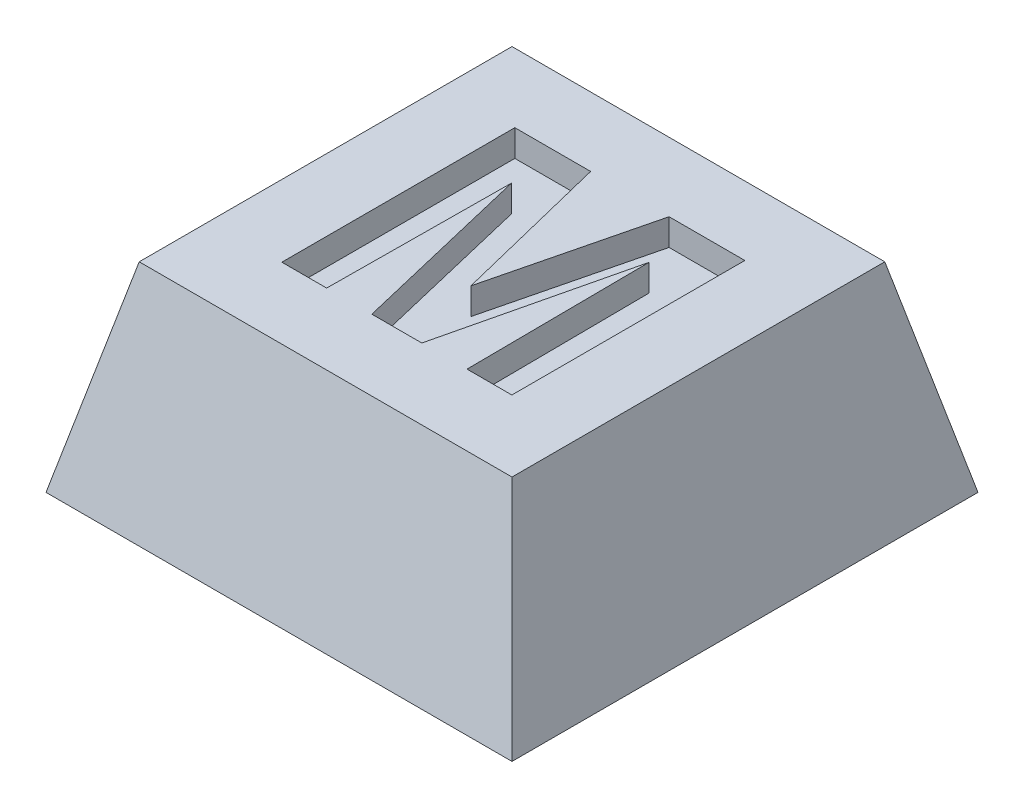
ISO-10303-21;
HEADER;
FILE_DESCRIPTION(('STEP AP214'),'2;1');
FILE_NAME('part.step','',(''),(''),'','','');
FILE_SCHEMA(('AUTOMOTIVE_DESIGN { 1 0 10303 214 1 1 1 1 }'));
ENDSEC;
DATA;
#1=APPLICATION_CONTEXT('core data for automotive mechanical design processes');
#2=APPLICATION_PROTOCOL_DEFINITION('international standard','automotive_design',2000,#1);
#3=PRODUCT_CONTEXT('',#1,'mechanical');
#4=PRODUCT('Part','Part','',(#3));
#5=PRODUCT_RELATED_PRODUCT_CATEGORY('part','',(#4));
#6=PRODUCT_DEFINITION_FORMATION('','',#4);
#7=PRODUCT_DEFINITION_CONTEXT('part definition',#1,'design');
#8=PRODUCT_DEFINITION('design','',#6,#7);
#9=PRODUCT_DEFINITION_SHAPE('','',#8);
#10=(LENGTH_UNIT() NAMED_UNIT(*) SI_UNIT(.MILLI.,.METRE.));
#11=(NAMED_UNIT(*) PLANE_ANGLE_UNIT() SI_UNIT($,.RADIAN.));
#12=(NAMED_UNIT(*) SI_UNIT($,.STERADIAN.) SOLID_ANGLE_UNIT());
#13=UNCERTAINTY_MEASURE_WITH_UNIT(LENGTH_MEASURE(1.E-05),#10,'distance_accuracy_value','');
#14=(GEOMETRIC_REPRESENTATION_CONTEXT(3) GLOBAL_UNCERTAINTY_ASSIGNED_CONTEXT((#13)) GLOBAL_UNIT_ASSIGNED_CONTEXT((#10,
#11,#12)) REPRESENTATION_CONTEXT('',''));
#15=CARTESIAN_POINT('',(0.,0.,0.));
#16=DIRECTION('',(0.,0.,1.));
#17=DIRECTION('',(1.,0.,0.));
#18=AXIS2_PLACEMENT_3D('',#15,#16,#17);
#19=CARTESIAN_POINT('',(0.,3.,0.));
#20=DIRECTION('',(0.,-1.,0.));
#21=DIRECTION('',(0.,0.,-1.));
#22=AXIS2_PLACEMENT_3D('',#19,#20,#21);
#23=PLANE('',#22);
#24=DIRECTION('',(-1.,0.,0.));
#25=VECTOR('',#24,1.);
#26=CARTESIAN_POINT('',(11.,3.,-0.7));
#27=LINE('',#26,#25);
#28=CARTESIAN_POINT('',(6.3,3.,-0.7));
#29=VERTEX_POINT('',#28);
#30=CARTESIAN_POINT('',(0.7,3.,-0.7));
#31=VERTEX_POINT('',#30);
#32=EDGE_CURVE('E65',#29,#31,#27,.T.);
#33=ORIENTED_EDGE('',*,*,#32,.F.);
#34=DIRECTION('',(0.,0.,1.));
#35=VECTOR('',#34,1.);
#36=CARTESIAN_POINT('',(6.3,3.,-7.));
#37=LINE('',#36,#35);
#38=CARTESIAN_POINT('',(6.3,3.,-6.3));
#39=VERTEX_POINT('',#38);
#40=EDGE_CURVE('E212',#39,#29,#37,.T.);
#41=ORIENTED_EDGE('',*,*,#40,.F.);
#42=DIRECTION('',(-1.,0.,0.));
#43=VECTOR('',#42,1.);
#44=CARTESIAN_POINT('',(11.,3.,-6.3));
#45=LINE('',#44,#43);
#46=CARTESIAN_POINT('',(0.699999999999998,3.,-6.3));
#47=VERTEX_POINT('',#46);
#48=EDGE_CURVE('E199',#39,#47,#45,.T.);
#49=ORIENTED_EDGE('',*,*,#48,.T.);
#50=DIRECTION('',(0.,0.,1.));
#51=VECTOR('',#50,1.);
#52=CARTESIAN_POINT('',(0.7,3.,-7.));
#53=LINE('',#52,#51);
#54=EDGE_CURVE('E213',#47,#31,#53,.T.);
#55=ORIENTED_EDGE('',*,*,#54,.T.);
#56=EDGE_LOOP('',(#33,#41,#49,#55));
#57=FACE_BOUND('',#56,.T.);
#58=DIRECTION('',(-1.,0.,0.));
#59=VECTOR('',#58,1.);
#60=CARTESIAN_POINT('',(2.44959526303558,3.,-1.76602931918881));
#61=LINE('',#60,#59);
#62=CARTESIAN_POINT('',(2.44959526303558,3.,-1.76602931918881));
#63=VERTEX_POINT('',#62);
#64=CARTESIAN_POINT('',(1.77651833995866,3.,-1.76602931918881));
#65=VERTEX_POINT('',#64);
#66=EDGE_CURVE('E58',#63,#65,#61,.T.);
#67=ORIENTED_EDGE('',*,*,#66,.T.);
#68=DIRECTION('',(0.,0.,-1.));
#69=VECTOR('',#68,1.);
#70=CARTESIAN_POINT('',(1.77651833995866,3.,-1.76602931918881));
#71=LINE('',#70,#69);
#72=CARTESIAN_POINT('',(1.77651833995866,3.,-5.26602931918881));
#73=VERTEX_POINT('',#72);
#74=EDGE_CURVE('E183',#65,#73,#71,.T.);
#75=ORIENTED_EDGE('',*,*,#74,.T.);
#76=DIRECTION('',(1.,0.,0.));
#77=VECTOR('',#76,1.);
#78=CARTESIAN_POINT('',(1.77651833995866,3.,-5.26602931918881));
#79=LINE('',#78,#77);
#80=CARTESIAN_POINT('',(2.91514013483045,3.,-5.26602931918881));
#81=VERTEX_POINT('',#80);
#82=EDGE_CURVE('E553',#73,#81,#79,.T.);
#83=ORIENTED_EDGE('',*,*,#82,.T.);
#84=DIRECTION('',(0.239515349551575,0.,0.970892577646563));
#85=VECTOR('',#84,1.);
#86=CARTESIAN_POINT('',(2.91514013483045,3.,-5.26602931918881));
#87=LINE('',#86,#85);
#88=CARTESIAN_POINT('',(3.50408244252276,3.,-2.87870960765035));
#89=VERTEX_POINT('',#88);
#90=EDGE_CURVE('E555',#81,#89,#87,.T.);
#91=ORIENTED_EDGE('',*,*,#90,.T.);
#92=DIRECTION('',(0.239515349551575,0.,-0.970892577646563));
#93=VECTOR('',#92,1.);
#94=CARTESIAN_POINT('',(3.50408244252276,3.,-2.87870960765035));
#95=LINE('',#94,#93);
#96=CARTESIAN_POINT('',(4.09302475021507,3.,-5.26602931918881));
#97=VERTEX_POINT('',#96);
#98=EDGE_CURVE('E560',#89,#97,#95,.T.);
#99=ORIENTED_EDGE('',*,*,#98,.T.);
#100=DIRECTION('',(1.,0.,0.));
#101=VECTOR('',#100,1.);
#102=CARTESIAN_POINT('',(4.09302475021507,3.,-5.26602931918881));
#103=LINE('',#102,#101);
#104=CARTESIAN_POINT('',(5.23164654508687,3.,-5.26602931918881));
#105=VERTEX_POINT('',#104);
#106=EDGE_CURVE('E570',#97,#105,#103,.T.);
#107=ORIENTED_EDGE('',*,*,#106,.T.);
#108=DIRECTION('',(0.,0.,1.));
#109=VECTOR('',#108,1.);
#110=CARTESIAN_POINT('',(5.23164654508687,3.,-5.26602931918881));
#111=LINE('',#110,#109);
#112=CARTESIAN_POINT('',(5.23164654508687,3.,-1.76602931918881));
#113=VERTEX_POINT('',#112);
#114=EDGE_CURVE('E574',#105,#113,#111,.T.);
#115=ORIENTED_EDGE('',*,*,#114,.T.);
#116=DIRECTION('',(-1.,0.,0.));
#117=VECTOR('',#116,1.);
#118=CARTESIAN_POINT('',(5.23164654508687,3.,-1.76602931918881));
#119=LINE('',#118,#117);
#120=CARTESIAN_POINT('',(4.55856962200994,3.,-1.76602931918881));
#121=VERTEX_POINT('',#120);
#122=EDGE_CURVE('E578',#113,#121,#119,.T.);
#123=ORIENTED_EDGE('',*,*,#122,.T.);
#124=DIRECTION('',(-0.00814222372760871,0.,-0.999966851546975));
#125=VECTOR('',#124,1.);
#126=CARTESIAN_POINT('',(4.55856962200994,3.,-1.76602931918881));
#127=LINE('',#126,#125);
#128=CARTESIAN_POINT('',(4.53613372457405,3.,-4.52143797303496));
#129=VERTEX_POINT('',#128);
#130=EDGE_CURVE('E582',#121,#129,#127,.T.);
#131=ORIENTED_EDGE('',*,*,#130,.T.);
#132=DIRECTION('',(-0.231921677320602,0.,0.972734463041584));
#133=VECTOR('',#132,1.);
#134=CARTESIAN_POINT('',(4.53613372457405,3.,-4.52143797303496));
#135=LINE('',#134,#133);
#136=CARTESIAN_POINT('',(3.87918260277917,3.,-1.76602931918881));
#137=VERTEX_POINT('',#136);
#138=EDGE_CURVE('E516',#129,#137,#135,.T.);
#139=ORIENTED_EDGE('',*,*,#138,.T.);
#140=DIRECTION('',(-1.,0.,0.));
#141=VECTOR('',#140,1.);
#142=CARTESIAN_POINT('',(3.87918260277917,3.,-1.76602931918881));
#143=LINE('',#142,#141);
#144=CARTESIAN_POINT('',(3.12898228226635,3.,-1.76602931918881));
#145=VERTEX_POINT('',#144);
#146=EDGE_CURVE('E511',#137,#145,#143,.T.);
#147=ORIENTED_EDGE('',*,*,#146,.T.);
#148=DIRECTION('',(-0.231921677320602,0.,-0.972734463041584));
#149=VECTOR('',#148,1.);
#150=CARTESIAN_POINT('',(3.12898228226635,3.,-1.76602931918881));
#151=LINE('',#150,#149);
#152=CARTESIAN_POINT('',(2.47203116047148,3.,-4.52143797303496));
#153=VERTEX_POINT('',#152);
#154=EDGE_CURVE('E505',#145,#153,#151,.T.);
#155=ORIENTED_EDGE('',*,*,#154,.T.);
#156=DIRECTION('',(-0.00814222372760903,0.,0.999966851546975));
#157=VECTOR('',#156,1.);
#158=CARTESIAN_POINT('',(2.47203116047148,3.,-4.52143797303496));
#159=LINE('',#158,#157);
#160=EDGE_CURVE('E179',#153,#63,#159,.T.);
#161=ORIENTED_EDGE('',*,*,#160,.T.);
#162=EDGE_LOOP('',(#67,#75,#83,#91,#99,#107,#115,#123,#131,#139,#147,#155,#161));
#163=FACE_BOUND('',#162,.T.);
#164=ADVANCED_FACE('F42',(#57,#163),#23,.F.);
#165=CARTESIAN_POINT('',(7.,0.,-7.));
#166=DIRECTION('',(-0.973841209741793,-0.227229615606418,0.));
#167=DIRECTION('',(0.227229615606418,-0.973841209741793,0.));
#168=AXIS2_PLACEMENT_3D('',#165,#166,#167);
#169=PLANE('',#168);
#170=DIRECTION('',(-0.221581128241521,0.949633406749377,-0.221581128241521));
#171=VECTOR('',#170,1.);
#172=CARTESIAN_POINT('',(6.6563126252505,1.47294589178357,-0.343687374749499));
#173=LINE('',#172,#171);
#174=CARTESIAN_POINT('',(7.,0.,0.));
#175=VERTEX_POINT('',#174);
#176=EDGE_CURVE('E209',#175,#29,#173,.T.);
#177=ORIENTED_EDGE('',*,*,#176,.F.);
#178=DIRECTION('',(0.,0.,-1.));
#179=VECTOR('',#178,1.);
#180=CARTESIAN_POINT('',(7.,0.,0.));
#181=LINE('',#180,#179);
#182=CARTESIAN_POINT('',(7.,0.,-7.));
#183=VERTEX_POINT('',#182);
#184=EDGE_CURVE('E227',#175,#183,#181,.T.);
#185=ORIENTED_EDGE('',*,*,#184,.T.);
#186=DIRECTION('',(0.221581128241521,-0.949633406749377,-0.221581128241521));
#187=VECTOR('',#186,1.);
#188=CARTESIAN_POINT('',(7.,0.,-7.));
#189=LINE('',#188,#187);
#190=EDGE_CURVE('E203',#39,#183,#189,.T.);
#191=ORIENTED_EDGE('',*,*,#190,.F.);
#192=ORIENTED_EDGE('',*,*,#40,.T.);
#193=EDGE_LOOP('',(#177,#185,#191,#192));
#194=FACE_BOUND('',#193,.T.);
#195=ADVANCED_FACE('F252',(#194),#169,.F.);
#196=CARTESIAN_POINT('',(0.,0.,-7.));
#197=DIRECTION('',(0.973841209741793,-0.227229615606418,0.));
#198=DIRECTION('',(0.227229615606418,0.973841209741793,0.));
#199=AXIS2_PLACEMENT_3D('',#196,#197,#198);
#200=PLANE('',#199);
#201=DIRECTION('',(-0.221581128241521,-0.949633406749378,0.221581128241521));
#202=VECTOR('',#201,1.);
#203=CARTESIAN_POINT('',(0.343687374749499,1.47294589178357,-0.3436873747495));
#204=LINE('',#203,#202);
#205=CARTESIAN_POINT('',(0.,0.,0.));
#206=VERTEX_POINT('',#205);
#207=EDGE_CURVE('E11',#31,#206,#204,.T.);
#208=ORIENTED_EDGE('',*,*,#207,.F.);
#209=ORIENTED_EDGE('',*,*,#54,.F.);
#210=DIRECTION('',(0.221581128241521,0.949633406749377,0.221581128241521));
#211=VECTOR('',#210,1.);
#212=CARTESIAN_POINT('',(0.,0.,-7.));
#213=LINE('',#212,#211);
#214=CARTESIAN_POINT('',(0.,0.,-7.));
#215=VERTEX_POINT('',#214);
#216=EDGE_CURVE('E51',#215,#47,#213,.T.);
#217=ORIENTED_EDGE('',*,*,#216,.F.);
#218=DIRECTION('',(0.,0.,1.));
#219=VECTOR('',#218,1.);
#220=CARTESIAN_POINT('',(0.,0.,0.));
#221=LINE('',#220,#219);
#222=EDGE_CURVE('E217',#215,#206,#221,.T.);
#223=ORIENTED_EDGE('',*,*,#222,.T.);
#224=EDGE_LOOP('',(#208,#209,#217,#223));
#225=FACE_BOUND('',#224,.T.);
#226=ADVANCED_FACE('F245',(#225),#200,.F.);
#227=CARTESIAN_POINT('',(0.,0.,0.));
#228=DIRECTION('',(0.,-1.,0.));
#229=DIRECTION('',(0.,0.,-1.));
#230=AXIS2_PLACEMENT_3D('',#227,#228,#229);
#231=PLANE('',#230);
#232=CARTESIAN_POINT('',(3.5,0.,-3.5));
#233=DIRECTION('',(0.,-1.,0.));
#234=DIRECTION('',(0.,0.,-1.));
#235=AXIS2_PLACEMENT_3D('',#232,#233,#234);
#236=CIRCLE('',#235,1.8);
#237=CARTESIAN_POINT('',(3.5,0.,-5.3));
#238=VERTEX_POINT('',#237);
#239=EDGE_CURVE('E185',#238,#238,#236,.T.);
#240=ORIENTED_EDGE('',*,*,#239,.F.);
#241=EDGE_LOOP('',(#240));
#242=FACE_BOUND('',#241,.T.);
#243=ORIENTED_EDGE('',*,*,#222,.F.);
#244=DIRECTION('',(-1.,0.,0.));
#245=VECTOR('',#244,1.);
#246=CARTESIAN_POINT('',(0.,0.,-7.));
#247=LINE('',#246,#245);
#248=EDGE_CURVE('E231',#183,#215,#247,.T.);
#249=ORIENTED_EDGE('',*,*,#248,.F.);
#250=ORIENTED_EDGE('',*,*,#184,.F.);
#251=DIRECTION('',(1.,0.,0.));
#252=VECTOR('',#251,1.);
#253=CARTESIAN_POINT('',(0.,0.,0.));
#254=LINE('',#253,#252);
#255=EDGE_CURVE('E224',#206,#175,#254,.T.);
#256=ORIENTED_EDGE('',*,*,#255,.F.);
#257=EDGE_LOOP('',(#243,#249,#250,#256));
#258=FACE_BOUND('',#257,.T.);
#259=ADVANCED_FACE('F44',(#242,#258),#231,.T.);
#260=CARTESIAN_POINT('',(11.,3.,-6.3));
#261=DIRECTION('',(0.,0.227229615606418,-0.973841209741793));
#262=DIRECTION('',(0.,0.973841209741793,0.227229615606418));
#263=AXIS2_PLACEMENT_3D('',#260,#261,#262);
#264=PLANE('',#263);
#265=ORIENTED_EDGE('',*,*,#190,.T.);
#266=ORIENTED_EDGE('',*,*,#248,.T.);
#267=ORIENTED_EDGE('',*,*,#216,.T.);
#268=ORIENTED_EDGE('',*,*,#48,.F.);
#269=EDGE_LOOP('',(#265,#266,#267,#268));
#270=FACE_BOUND('',#269,.T.);
#271=ADVANCED_FACE('F236',(#270),#264,.T.);
#272=CARTESIAN_POINT('',(11.,0.,0.));
#273=DIRECTION('',(0.,0.227229615606418,0.973841209741793));
#274=DIRECTION('',(0.,-0.973841209741793,0.227229615606418));
#275=AXIS2_PLACEMENT_3D('',#272,#273,#274);
#276=PLANE('',#275);
#277=ORIENTED_EDGE('',*,*,#176,.T.);
#278=ORIENTED_EDGE('',*,*,#32,.T.);
#279=ORIENTED_EDGE('',*,*,#207,.T.);
#280=ORIENTED_EDGE('',*,*,#255,.T.);
#281=EDGE_LOOP('',(#277,#278,#279,#280));
#282=FACE_BOUND('',#281,.T.);
#283=ADVANCED_FACE('F247',(#282),#276,.T.);
#284=CARTESIAN_POINT('',(3.5,0.8,-3.5));
#285=DIRECTION('',(0.,-1.,0.));
#286=DIRECTION('',(0.,0.,-1.));
#287=AXIS2_PLACEMENT_3D('',#284,#285,#286);
#288=CYLINDRICAL_SURFACE('',#287,1.8);
#289=CARTESIAN_POINT('',(3.5,0.8,-3.5));
#290=DIRECTION('',(0.,-1.,0.));
#291=DIRECTION('',(0.,0.,-1.));
#292=AXIS2_PLACEMENT_3D('',#289,#290,#291);
#293=CIRCLE('',#292,1.8);
#294=CARTESIAN_POINT('',(3.5,0.8,-5.3));
#295=VERTEX_POINT('',#294);
#296=EDGE_CURVE('E191',#295,#295,#293,.T.);
#297=ORIENTED_EDGE('',*,*,#296,.F.);
#298=EDGE_LOOP('',(#297));
#299=FACE_BOUND('',#298,.T.);
#300=ORIENTED_EDGE('',*,*,#239,.T.);
#301=EDGE_LOOP('',(#300));
#302=FACE_BOUND('',#301,.T.);
#303=ADVANCED_FACE('F272',(#299,#302),#288,.F.);
#304=CARTESIAN_POINT('',(3.5,0.8,-3.5));
#305=DIRECTION('',(0.,-1.,0.));
#306=DIRECTION('',(0.,0.,-1.));
#307=AXIS2_PLACEMENT_3D('',#304,#305,#306);
#308=PLANE('',#307);
#309=ORIENTED_EDGE('',*,*,#296,.T.);
#310=EDGE_LOOP('',(#309));
#311=FACE_BOUND('',#310,.T.);
#312=ADVANCED_FACE('F275',(#311),#308,.T.);
#313=CARTESIAN_POINT('',(2.44959526303558,2.6,-1.76602931918881));
#314=DIRECTION('',(0.,0.,-1.));
#315=DIRECTION('',(-1.,0.,0.));
#316=AXIS2_PLACEMENT_3D('',#313,#314,#315);
#317=PLANE('',#316);
#318=ORIENTED_EDGE('',*,*,#66,.F.);
#319=DIRECTION('',(0.,1.,0.));
#320=VECTOR('',#319,1.);
#321=CARTESIAN_POINT('',(2.44959526303558,2.6,-1.76602931918881));
#322=LINE('',#321,#320);
#323=CARTESIAN_POINT('',(2.44959526303558,2.6,-1.76602931918881));
#324=VERTEX_POINT('',#323);
#325=EDGE_CURVE('E177',#324,#63,#322,.T.);
#326=ORIENTED_EDGE('',*,*,#325,.F.);
#327=DIRECTION('',(-1.,0.,0.));
#328=VECTOR('',#327,1.);
#329=CARTESIAN_POINT('',(2.44959526303558,2.6,-1.76602931918881));
#330=LINE('',#329,#328);
#331=CARTESIAN_POINT('',(1.77651833995866,2.6,-1.76602931918881));
#332=VERTEX_POINT('',#331);
#333=EDGE_CURVE('E167',#324,#332,#330,.T.);
#334=ORIENTED_EDGE('',*,*,#333,.T.);
#335=DIRECTION('',(0.,1.,0.));
#336=VECTOR('',#335,1.);
#337=CARTESIAN_POINT('',(1.77651833995866,2.6,-1.76602931918881));
#338=LINE('',#337,#336);
#339=EDGE_CURVE('E176',#332,#65,#338,.T.);
#340=ORIENTED_EDGE('',*,*,#339,.T.);
#341=EDGE_LOOP('',(#318,#326,#334,#340));
#342=FACE_BOUND('',#341,.T.);
#343=ADVANCED_FACE('F175',(#342),#317,.T.);
#344=CARTESIAN_POINT('',(1.77651833995866,2.6,-1.76602931918881));
#345=DIRECTION('',(1.,0.,0.));
#346=DIRECTION('',(0.,0.,-1.));
#347=AXIS2_PLACEMENT_3D('',#344,#345,#346);
#348=PLANE('',#347);
#349=ORIENTED_EDGE('',*,*,#74,.F.);
#350=ORIENTED_EDGE('',*,*,#339,.F.);
#351=DIRECTION('',(0.,0.,-1.));
#352=VECTOR('',#351,1.);
#353=CARTESIAN_POINT('',(1.77651833995866,2.6,-1.76602931918881));
#354=LINE('',#353,#352);
#355=CARTESIAN_POINT('',(1.77651833995866,2.6,-5.26602931918881));
#356=VERTEX_POINT('',#355);
#357=EDGE_CURVE('E163',#332,#356,#354,.T.);
#358=ORIENTED_EDGE('',*,*,#357,.T.);
#359=DIRECTION('',(0.,1.,0.));
#360=VECTOR('',#359,1.);
#361=CARTESIAN_POINT('',(1.77651833995866,2.6,-5.26602931918881));
#362=LINE('',#361,#360);
#363=EDGE_CURVE('E186',#356,#73,#362,.T.);
#364=ORIENTED_EDGE('',*,*,#363,.T.);
#365=EDGE_LOOP('',(#349,#350,#358,#364));
#366=FACE_BOUND('',#365,.T.);
#367=ADVANCED_FACE('F181',(#366),#348,.T.);
#368=CARTESIAN_POINT('',(1.77651833995866,2.6,-5.26602931918881));
#369=DIRECTION('',(0.,0.,1.));
#370=DIRECTION('',(1.,0.,0.));
#371=AXIS2_PLACEMENT_3D('',#368,#369,#370);
#372=PLANE('',#371);
#373=ORIENTED_EDGE('',*,*,#82,.F.);
#374=ORIENTED_EDGE('',*,*,#363,.F.);
#375=DIRECTION('',(1.,0.,0.));
#376=VECTOR('',#375,1.);
#377=CARTESIAN_POINT('',(1.77651833995866,2.6,-5.26602931918881));
#378=LINE('',#377,#376);
#379=CARTESIAN_POINT('',(2.91514013483045,2.6,-5.26602931918881));
#380=VERTEX_POINT('',#379);
#381=EDGE_CURVE('E169',#356,#380,#378,.T.);
#382=ORIENTED_EDGE('',*,*,#381,.T.);
#383=DIRECTION('',(0.,1.,0.));
#384=VECTOR('',#383,1.);
#385=CARTESIAN_POINT('',(2.91514013483045,2.6,-5.26602931918881));
#386=LINE('',#385,#384);
#387=EDGE_CURVE('E193',#380,#81,#386,.T.);
#388=ORIENTED_EDGE('',*,*,#387,.T.);
#389=EDGE_LOOP('',(#373,#374,#382,#388));
#390=FACE_BOUND('',#389,.T.);
#391=ADVANCED_FACE('F284',(#390),#372,.T.);
#392=CARTESIAN_POINT('',(2.91514013483045,2.6,-5.26602931918881));
#393=DIRECTION('',(-0.970892577646563,0.,0.239515349551575));
#394=DIRECTION('',(0.239515349551575,0.,0.970892577646563));
#395=AXIS2_PLACEMENT_3D('',#392,#393,#394);
#396=PLANE('',#395);
#397=ORIENTED_EDGE('',*,*,#90,.F.);
#398=ORIENTED_EDGE('',*,*,#387,.F.);
#399=DIRECTION('',(0.239515349551575,0.,0.970892577646563));
#400=VECTOR('',#399,1.);
#401=CARTESIAN_POINT('',(2.91514013483045,2.6,-5.26602931918881));
#402=LINE('',#401,#400);
#403=CARTESIAN_POINT('',(3.50408244252276,2.6,-2.87870960765035));
#404=VERTEX_POINT('',#403);
#405=EDGE_CURVE('E621',#380,#404,#402,.T.);
#406=ORIENTED_EDGE('',*,*,#405,.T.);
#407=DIRECTION('',(0.,1.,0.));
#408=VECTOR('',#407,1.);
#409=CARTESIAN_POINT('',(3.50408244252276,2.6,-2.87870960765035));
#410=LINE('',#409,#408);
#411=EDGE_CURVE('E546',#404,#89,#410,.T.);
#412=ORIENTED_EDGE('',*,*,#411,.T.);
#413=EDGE_LOOP('',(#397,#398,#406,#412));
#414=FACE_BOUND('',#413,.T.);
#415=ADVANCED_FACE('F287',(#414),#396,.T.);
#416=CARTESIAN_POINT('',(3.50408244252276,2.6,-2.87870960765035));
#417=DIRECTION('',(0.970892577646563,0.,0.239515349551575));
#418=DIRECTION('',(0.239515349551575,0.,-0.970892577646563));
#419=AXIS2_PLACEMENT_3D('',#416,#417,#418);
#420=PLANE('',#419);
#421=ORIENTED_EDGE('',*,*,#98,.F.);
#422=ORIENTED_EDGE('',*,*,#411,.F.);
#423=DIRECTION('',(0.239515349551575,0.,-0.970892577646563));
#424=VECTOR('',#423,1.);
#425=CARTESIAN_POINT('',(3.50408244252276,2.6,-2.87870960765035));
#426=LINE('',#425,#424);
#427=CARTESIAN_POINT('',(4.09302475021507,2.6,-5.26602931918881));
#428=VERTEX_POINT('',#427);
#429=EDGE_CURVE('E618',#404,#428,#426,.T.);
#430=ORIENTED_EDGE('',*,*,#429,.T.);
#431=DIRECTION('',(0.,1.,0.));
#432=VECTOR('',#431,1.);
#433=CARTESIAN_POINT('',(4.09302475021507,2.6,-5.26602931918881));
#434=LINE('',#433,#432);
#435=EDGE_CURVE('E543',#428,#97,#434,.T.);
#436=ORIENTED_EDGE('',*,*,#435,.T.);
#437=EDGE_LOOP('',(#421,#422,#430,#436));
#438=FACE_BOUND('',#437,.T.);
#439=ADVANCED_FACE('F291',(#438),#420,.T.);
#440=CARTESIAN_POINT('',(4.09302475021507,2.6,-5.26602931918881));
#441=DIRECTION('',(0.,0.,1.));
#442=DIRECTION('',(1.,0.,0.));
#443=AXIS2_PLACEMENT_3D('',#440,#441,#442);
#444=PLANE('',#443);
#445=ORIENTED_EDGE('',*,*,#106,.F.);
#446=ORIENTED_EDGE('',*,*,#435,.F.);
#447=DIRECTION('',(1.,0.,0.));
#448=VECTOR('',#447,1.);
#449=CARTESIAN_POINT('',(4.09302475021507,2.6,-5.26602931918881));
#450=LINE('',#449,#448);
#451=CARTESIAN_POINT('',(5.23164654508687,2.6,-5.26602931918881));
#452=VERTEX_POINT('',#451);
#453=EDGE_CURVE('E615',#428,#452,#450,.T.);
#454=ORIENTED_EDGE('',*,*,#453,.T.);
#455=DIRECTION('',(0.,1.,0.));
#456=VECTOR('',#455,1.);
#457=CARTESIAN_POINT('',(5.23164654508687,2.6,-5.26602931918881));
#458=LINE('',#457,#456);
#459=EDGE_CURVE('E540',#452,#105,#458,.T.);
#460=ORIENTED_EDGE('',*,*,#459,.T.);
#461=EDGE_LOOP('',(#445,#446,#454,#460));
#462=FACE_BOUND('',#461,.T.);
#463=ADVANCED_FACE('F295',(#462),#444,.T.);
#464=CARTESIAN_POINT('',(5.23164654508687,2.6,-5.26602931918881));
#465=DIRECTION('',(-1.,0.,0.));
#466=DIRECTION('',(0.,0.,1.));
#467=AXIS2_PLACEMENT_3D('',#464,#465,#466);
#468=PLANE('',#467);
#469=ORIENTED_EDGE('',*,*,#114,.F.);
#470=ORIENTED_EDGE('',*,*,#459,.F.);
#471=DIRECTION('',(0.,0.,1.));
#472=VECTOR('',#471,1.);
#473=CARTESIAN_POINT('',(5.23164654508687,2.6,-5.26602931918881));
#474=LINE('',#473,#472);
#475=CARTESIAN_POINT('',(5.23164654508687,2.6,-1.76602931918881));
#476=VERTEX_POINT('',#475);
#477=EDGE_CURVE('E612',#452,#476,#474,.T.);
#478=ORIENTED_EDGE('',*,*,#477,.T.);
#479=DIRECTION('',(0.,1.,0.));
#480=VECTOR('',#479,1.);
#481=CARTESIAN_POINT('',(5.23164654508687,2.6,-1.76602931918881));
#482=LINE('',#481,#480);
#483=EDGE_CURVE('E537',#476,#113,#482,.T.);
#484=ORIENTED_EDGE('',*,*,#483,.T.);
#485=EDGE_LOOP('',(#469,#470,#478,#484));
#486=FACE_BOUND('',#485,.T.);
#487=ADVANCED_FACE('F299',(#486),#468,.T.);
#488=CARTESIAN_POINT('',(5.23164654508687,2.6,-1.76602931918881));
#489=DIRECTION('',(0.,0.,-1.));
#490=DIRECTION('',(-1.,0.,0.));
#491=AXIS2_PLACEMENT_3D('',#488,#489,#490);
#492=PLANE('',#491);
#493=ORIENTED_EDGE('',*,*,#122,.F.);
#494=ORIENTED_EDGE('',*,*,#483,.F.);
#495=DIRECTION('',(-1.,0.,0.));
#496=VECTOR('',#495,1.);
#497=CARTESIAN_POINT('',(5.23164654508687,2.6,-1.76602931918881));
#498=LINE('',#497,#496);
#499=CARTESIAN_POINT('',(4.55856962200994,2.6,-1.76602931918881));
#500=VERTEX_POINT('',#499);
#501=EDGE_CURVE('E609',#476,#500,#498,.T.);
#502=ORIENTED_EDGE('',*,*,#501,.T.);
#503=DIRECTION('',(0.,1.,0.));
#504=VECTOR('',#503,1.);
#505=CARTESIAN_POINT('',(4.55856962200994,2.6,-1.76602931918881));
#506=LINE('',#505,#504);
#507=EDGE_CURVE('E534',#500,#121,#506,.T.);
#508=ORIENTED_EDGE('',*,*,#507,.T.);
#509=EDGE_LOOP('',(#493,#494,#502,#508));
#510=FACE_BOUND('',#509,.T.);
#511=ADVANCED_FACE('F303',(#510),#492,.T.);
#512=CARTESIAN_POINT('',(4.55856962200994,2.6,-1.76602931918881));
#513=DIRECTION('',(0.999966851546975,0.,-0.00814222372760871));
#514=DIRECTION('',(-0.00814222372760871,0.,-0.999966851546975));
#515=AXIS2_PLACEMENT_3D('',#512,#513,#514);
#516=PLANE('',#515);
#517=ORIENTED_EDGE('',*,*,#130,.F.);
#518=ORIENTED_EDGE('',*,*,#507,.F.);
#519=DIRECTION('',(-0.00814222372760871,0.,-0.999966851546975));
#520=VECTOR('',#519,1.);
#521=CARTESIAN_POINT('',(4.55856962200994,2.6,-1.76602931918881));
#522=LINE('',#521,#520);
#523=CARTESIAN_POINT('',(4.53613372457405,2.6,-4.52143797303496));
#524=VERTEX_POINT('',#523);
#525=EDGE_CURVE('E606',#500,#524,#522,.T.);
#526=ORIENTED_EDGE('',*,*,#525,.T.);
#527=DIRECTION('',(0.,1.,0.));
#528=VECTOR('',#527,1.);
#529=CARTESIAN_POINT('',(4.53613372457405,2.6,-4.52143797303496));
#530=LINE('',#529,#528);
#531=EDGE_CURVE('E531',#524,#129,#530,.T.);
#532=ORIENTED_EDGE('',*,*,#531,.T.);
#533=EDGE_LOOP('',(#517,#518,#526,#532));
#534=FACE_BOUND('',#533,.T.);
#535=ADVANCED_FACE('F307',(#534),#516,.T.);
#536=CARTESIAN_POINT('',(4.53613372457405,2.6,-4.52143797303496));
#537=DIRECTION('',(-0.972734463041584,0.,-0.231921677320602));
#538=DIRECTION('',(-0.231921677320602,0.,0.972734463041584));
#539=AXIS2_PLACEMENT_3D('',#536,#537,#538);
#540=PLANE('',#539);
#541=ORIENTED_EDGE('',*,*,#138,.F.);
#542=ORIENTED_EDGE('',*,*,#531,.F.);
#543=DIRECTION('',(-0.231921677320602,0.,0.972734463041584));
#544=VECTOR('',#543,1.);
#545=CARTESIAN_POINT('',(4.53613372457405,2.6,-4.52143797303496));
#546=LINE('',#545,#544);
#547=CARTESIAN_POINT('',(3.87918260277917,2.6,-1.76602931918881));
#548=VERTEX_POINT('',#547);
#549=EDGE_CURVE('E591',#524,#548,#546,.T.);
#550=ORIENTED_EDGE('',*,*,#549,.T.);
#551=DIRECTION('',(0.,1.,0.));
#552=VECTOR('',#551,1.);
#553=CARTESIAN_POINT('',(3.87918260277917,2.6,-1.76602931918881));
#554=LINE('',#553,#552);
#555=EDGE_CURVE('E528',#548,#137,#554,.T.);
#556=ORIENTED_EDGE('',*,*,#555,.T.);
#557=EDGE_LOOP('',(#541,#542,#550,#556));
#558=FACE_BOUND('',#557,.T.);
#559=ADVANCED_FACE('F311',(#558),#540,.T.);
#560=CARTESIAN_POINT('',(3.87918260277917,2.6,-1.76602931918881));
#561=DIRECTION('',(0.,0.,-1.));
#562=DIRECTION('',(-1.,0.,0.));
#563=AXIS2_PLACEMENT_3D('',#560,#561,#562);
#564=PLANE('',#563);
#565=ORIENTED_EDGE('',*,*,#146,.F.);
#566=ORIENTED_EDGE('',*,*,#555,.F.);
#567=DIRECTION('',(-1.,0.,0.));
#568=VECTOR('',#567,1.);
#569=CARTESIAN_POINT('',(3.87918260277917,2.6,-1.76602931918881));
#570=LINE('',#569,#568);
#571=CARTESIAN_POINT('',(3.12898228226635,2.6,-1.76602931918881));
#572=VERTEX_POINT('',#571);
#573=EDGE_CURVE('E593',#548,#572,#570,.T.);
#574=ORIENTED_EDGE('',*,*,#573,.T.);
#575=DIRECTION('',(0.,1.,0.));
#576=VECTOR('',#575,1.);
#577=CARTESIAN_POINT('',(3.12898228226635,2.6,-1.76602931918881));
#578=LINE('',#577,#576);
#579=EDGE_CURVE('E525',#572,#145,#578,.T.);
#580=ORIENTED_EDGE('',*,*,#579,.T.);
#581=EDGE_LOOP('',(#565,#566,#574,#580));
#582=FACE_BOUND('',#581,.T.);
#583=ADVANCED_FACE('F315',(#582),#564,.T.);
#584=CARTESIAN_POINT('',(3.12898228226635,2.6,-1.76602931918881));
#585=DIRECTION('',(0.972734463041584,0.,-0.231921677320602));
#586=DIRECTION('',(-0.231921677320602,0.,-0.972734463041584));
#587=AXIS2_PLACEMENT_3D('',#584,#585,#586);
#588=PLANE('',#587);
#589=ORIENTED_EDGE('',*,*,#154,.F.);
#590=ORIENTED_EDGE('',*,*,#579,.F.);
#591=DIRECTION('',(-0.231921677320602,0.,-0.972734463041584));
#592=VECTOR('',#591,1.);
#593=CARTESIAN_POINT('',(3.12898228226635,2.6,-1.76602931918881));
#594=LINE('',#593,#592);
#595=CARTESIAN_POINT('',(2.47203116047148,2.6,-4.52143797303496));
#596=VERTEX_POINT('',#595);
#597=EDGE_CURVE('E595',#572,#596,#594,.T.);
#598=ORIENTED_EDGE('',*,*,#597,.T.);
#599=DIRECTION('',(0.,1.,0.));
#600=VECTOR('',#599,1.);
#601=CARTESIAN_POINT('',(2.47203116047148,2.6,-4.52143797303496));
#602=LINE('',#601,#600);
#603=EDGE_CURVE('E503',#596,#153,#602,.T.);
#604=ORIENTED_EDGE('',*,*,#603,.T.);
#605=EDGE_LOOP('',(#589,#590,#598,#604));
#606=FACE_BOUND('',#605,.T.);
#607=ADVANCED_FACE('F319',(#606),#588,.T.);
#608=CARTESIAN_POINT('',(2.47203116047148,2.6,-4.52143797303496));
#609=DIRECTION('',(-0.999966851546975,0.,-0.00814222372760903));
#610=DIRECTION('',(-0.00814222372760903,0.,0.999966851546975));
#611=AXIS2_PLACEMENT_3D('',#608,#609,#610);
#612=PLANE('',#611);
#613=ORIENTED_EDGE('',*,*,#160,.F.);
#614=ORIENTED_EDGE('',*,*,#603,.F.);
#615=DIRECTION('',(-0.00814222372760903,0.,0.999966851546975));
#616=VECTOR('',#615,1.);
#617=CARTESIAN_POINT('',(2.47203116047148,2.6,-4.52143797303496));
#618=LINE('',#617,#616);
#619=EDGE_CURVE('E522',#596,#324,#618,.T.);
#620=ORIENTED_EDGE('',*,*,#619,.T.);
#621=ORIENTED_EDGE('',*,*,#325,.T.);
#622=EDGE_LOOP('',(#613,#614,#620,#621));
#623=FACE_BOUND('',#622,.T.);
#624=ADVANCED_FACE('F323',(#623),#612,.T.);
#625=CARTESIAN_POINT('',(0.,2.6,0.));
#626=DIRECTION('',(0.,-1.,0.));
#627=DIRECTION('',(0.,0.,-1.));
#628=AXIS2_PLACEMENT_3D('',#625,#626,#627);
#629=PLANE('',#628);
#630=ORIENTED_EDGE('',*,*,#333,.F.);
#631=ORIENTED_EDGE('',*,*,#619,.F.);
#632=ORIENTED_EDGE('',*,*,#597,.F.);
#633=ORIENTED_EDGE('',*,*,#573,.F.);
#634=ORIENTED_EDGE('',*,*,#549,.F.);
#635=ORIENTED_EDGE('',*,*,#525,.F.);
#636=ORIENTED_EDGE('',*,*,#501,.F.);
#637=ORIENTED_EDGE('',*,*,#477,.F.);
#638=ORIENTED_EDGE('',*,*,#453,.F.);
#639=ORIENTED_EDGE('',*,*,#429,.F.);
#640=ORIENTED_EDGE('',*,*,#405,.F.);
#641=ORIENTED_EDGE('',*,*,#381,.F.);
#642=ORIENTED_EDGE('',*,*,#357,.F.);
#643=EDGE_LOOP('',(#630,#631,#632,#633,#634,#635,#636,#637,#638,#639,#640,#641,#642));
#644=FACE_BOUND('',#643,.T.);
#645=ADVANCED_FACE('F165',(#644),#629,.F.);
#646=CLOSED_SHELL('',(#164,#195,#226,#259,#271,#283,#303,#312,#343,#367,#391,#415,#439,#463,
#487,#511,#535,#559,#583,#607,#624,#645));
#647=MANIFOLD_SOLID_BREP('B2',#646);
#648=ADVANCED_BREP_SHAPE_REPRESENTATION('',(#18,#647),#14);
#649=SHAPE_DEFINITION_REPRESENTATION(#9,#648);
ENDSEC;
END-ISO-10303-21;
